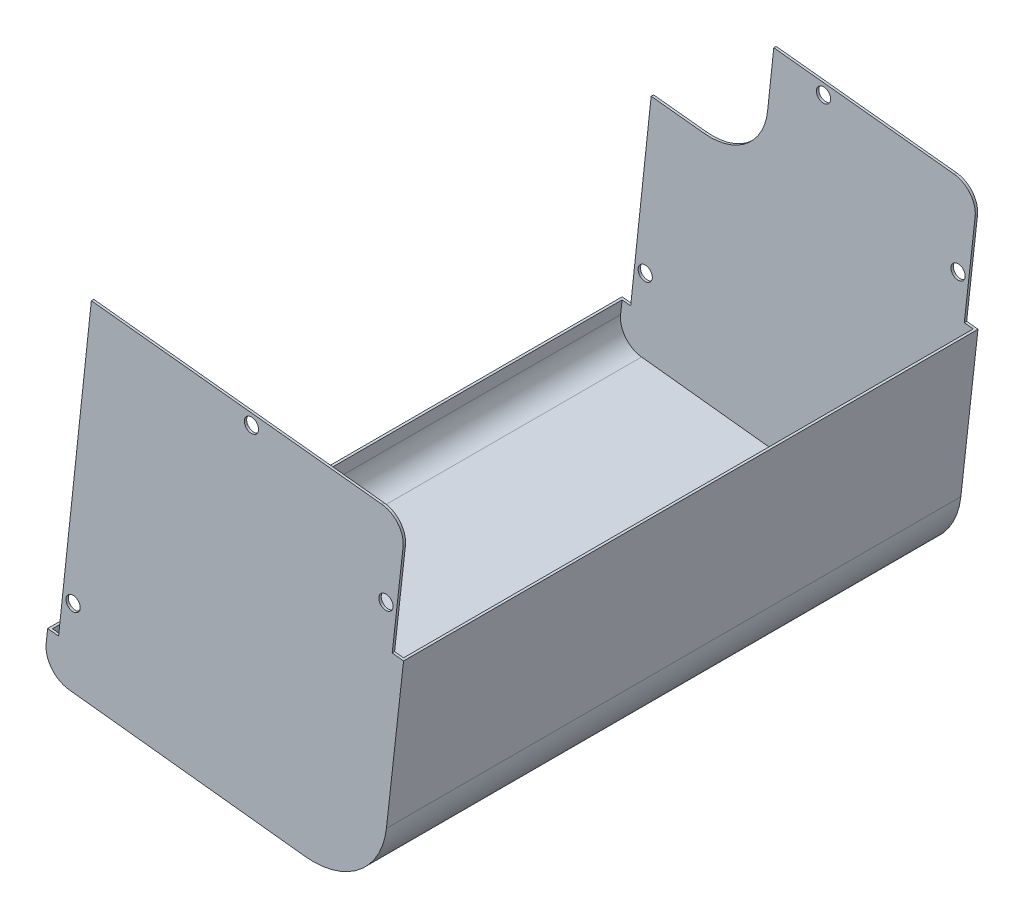
ISO-10303-21;
HEADER;
FILE_DESCRIPTION(('STEP AP214'),'2;1');
FILE_NAME('part.step','',(''),(''),'','','');
FILE_SCHEMA(('AUTOMOTIVE_DESIGN { 1 0 10303 214 1 1 1 1 }'));
ENDSEC;
DATA;
#1=APPLICATION_CONTEXT('core data for automotive mechanical design processes');
#2=APPLICATION_PROTOCOL_DEFINITION('international standard','automotive_design',2000,#1);
#3=PRODUCT_CONTEXT('',#1,'mechanical');
#4=PRODUCT('Part','Part','',(#3));
#5=PRODUCT_RELATED_PRODUCT_CATEGORY('part','',(#4));
#6=PRODUCT_DEFINITION_FORMATION('','',#4);
#7=PRODUCT_DEFINITION_CONTEXT('part definition',#1,'design');
#8=PRODUCT_DEFINITION('design','',#6,#7);
#9=PRODUCT_DEFINITION_SHAPE('','',#8);
#10=(LENGTH_UNIT() NAMED_UNIT(*) SI_UNIT(.MILLI.,.METRE.));
#11=(NAMED_UNIT(*) PLANE_ANGLE_UNIT() SI_UNIT($,.RADIAN.));
#12=(NAMED_UNIT(*) SI_UNIT($,.STERADIAN.) SOLID_ANGLE_UNIT());
#13=UNCERTAINTY_MEASURE_WITH_UNIT(LENGTH_MEASURE(1.E-05),#10,'distance_accuracy_value','');
#14=(GEOMETRIC_REPRESENTATION_CONTEXT(3) GLOBAL_UNCERTAINTY_ASSIGNED_CONTEXT((#13)) GLOBAL_UNIT_ASSIGNED_CONTEXT((#10,
#11,#12)) REPRESENTATION_CONTEXT('',''));
#15=CARTESIAN_POINT('',(0.,0.,0.));
#16=DIRECTION('',(0.,0.,1.));
#17=DIRECTION('',(1.,0.,0.));
#18=AXIS2_PLACEMENT_3D('',#15,#16,#17);
#19=CARTESIAN_POINT('',(88.6136563596164,-4.6918111080905,240.));
#20=DIRECTION('',(-0.110814083964882,-0.993841153703661,0.));
#21=DIRECTION('',(0.993841153703661,-0.110814083964882,0.));
#22=AXIS2_PLACEMENT_3D('',#19,#20,#21);
#23=PLANE('',#22);
#24=DIRECTION('',(-0.993841153703661,0.110814083964882,0.));
#25=VECTOR('',#24,1.);
#26=CARTESIAN_POINT('',(88.6136563596164,-4.6918111080905,0.));
#27=LINE('',#26,#25);
#28=CARTESIAN_POINT('',(88.6136563596164,-4.6918111080905,0.));
#29=VERTEX_POINT('',#28);
#30=CARTESIAN_POINT('',(84.8370599756829,-4.2707175890396,0.));
#31=VERTEX_POINT('',#30);
#32=EDGE_CURVE('E337',#29,#31,#27,.T.);
#33=ORIENTED_EDGE('',*,*,#32,.F.);
#34=DIRECTION('',(0.,0.,-1.));
#35=VECTOR('',#34,1.);
#36=CARTESIAN_POINT('',(88.6136563596164,-4.6918111080905,240.));
#37=LINE('',#36,#35);
#38=CARTESIAN_POINT('',(88.6136563596164,-4.6918111080905,240.));
#39=VERTEX_POINT('',#38);
#40=EDGE_CURVE('E365',#39,#29,#37,.T.);
#41=ORIENTED_EDGE('',*,*,#40,.F.);
#42=DIRECTION('',(-0.993841153703661,0.110814083964882,0.));
#43=VECTOR('',#42,1.);
#44=CARTESIAN_POINT('',(88.6136563596164,-4.6918111080905,240.));
#45=LINE('',#44,#43);
#46=CARTESIAN_POINT('',(84.8370599756829,-4.2707175890396,240.));
#47=VERTEX_POINT('',#46);
#48=EDGE_CURVE('E309',#39,#47,#45,.T.);
#49=ORIENTED_EDGE('',*,*,#48,.T.);
#50=DIRECTION('',(0.,0.,-1.));
#51=VECTOR('',#50,1.);
#52=CARTESIAN_POINT('',(84.8370599756829,-4.2707175890396,240.));
#53=LINE('',#52,#51);
#54=CARTESIAN_POINT('',(84.8370599756829,-4.2707175890396,241.));
#55=VERTEX_POINT('',#54);
#56=EDGE_CURVE('E378',#55,#47,#53,.T.);
#57=ORIENTED_EDGE('',*,*,#56,.F.);
#58=DIRECTION('',(-0.993841153703661,0.110814083964882,0.));
#59=VECTOR('',#58,1.);
#60=CARTESIAN_POINT('',(58.7984217485065,-1.36738858914402,241.));
#61=LINE('',#60,#59);
#62=CARTESIAN_POINT('',(89.60749751332,-4.80262519205538,241.));
#63=VERTEX_POINT('',#62);
#64=EDGE_CURVE('E252',#63,#55,#61,.T.);
#65=ORIENTED_EDGE('',*,*,#64,.F.);
#66=DIRECTION('',(0.,0.,-1.));
#67=VECTOR('',#66,1.);
#68=CARTESIAN_POINT('',(89.60749751332,-4.80262519205538,240.));
#69=LINE('',#68,#67);
#70=CARTESIAN_POINT('',(89.60749751332,-4.80262519205538,-1.));
#71=VERTEX_POINT('',#70);
#72=EDGE_CURVE('E381',#63,#71,#69,.T.);
#73=ORIENTED_EDGE('',*,*,#72,.T.);
#74=DIRECTION('',(-0.993841153703661,0.110814083964882,0.));
#75=VECTOR('',#74,1.);
#76=CARTESIAN_POINT('',(58.7984217485065,-1.36738858914402,-1.));
#77=LINE('',#76,#75);
#78=CARTESIAN_POINT('',(84.8370599756829,-4.2707175890396,-1.));
#79=VERTEX_POINT('',#78);
#80=EDGE_CURVE('E405',#71,#79,#77,.T.);
#81=ORIENTED_EDGE('',*,*,#80,.T.);
#82=EDGE_CURVE('E382',#31,#79,#53,.T.);
#83=ORIENTED_EDGE('',*,*,#82,.F.);
#84=EDGE_LOOP('',(#33,#41,#49,#57,#65,#73,#81,#83));
#85=FACE_BOUND('',#84,.T.);
#86=ADVANCED_FACE('F32',(#85),#23,.F.);
#87=CARTESIAN_POINT('',(89.4084892426148,36.7283537765712,240.));
#88=DIRECTION('',(-0.993841153703845,0.110814083963228,0.));
#89=DIRECTION('',(-0.110814083963228,-0.993841153703846,0.));
#90=AXIS2_PLACEMENT_3D('',#87,#88,#89);
#91=PLANE('',#90);
#92=DIRECTION('',(0.110814083963228,0.993841153703846,0.));
#93=VECTOR('',#92,1.);
#94=CARTESIAN_POINT('',(89.4084892426148,36.7283537765712,0.));
#95=LINE('',#94,#93);
#96=CARTESIAN_POINT('',(89.4084892426148,36.7283537765712,0.));
#97=VERTEX_POINT('',#96);
#98=EDGE_CURVE('E339',#31,#97,#95,.T.);
#99=ORIENTED_EDGE('',*,*,#98,.F.);
#100=ORIENTED_EDGE('',*,*,#82,.T.);
#101=DIRECTION('',(0.110814083963228,0.993841153703846,0.));
#102=VECTOR('',#101,1.);
#103=CARTESIAN_POINT('',(77.623843773693,-68.9627752744123,-1.));
#104=LINE('',#103,#102);
#105=CARTESIAN_POINT('',(89.4084892426148,36.7283537765712,-1.));
#106=VERTEX_POINT('',#105);
#107=EDGE_CURVE('E230',#79,#106,#104,.T.);
#108=ORIENTED_EDGE('',*,*,#107,.T.);
#109=DIRECTION('',(0.,0.,-1.));
#110=VECTOR('',#109,1.);
#111=CARTESIAN_POINT('',(89.4084892426148,36.7283537765712,240.));
#112=LINE('',#111,#110);
#113=EDGE_CURVE('E386',#97,#106,#112,.T.);
#114=ORIENTED_EDGE('',*,*,#113,.F.);
#115=EDGE_LOOP('',(#99,#100,#108,#114));
#116=FACE_BOUND('',#115,.T.);
#117=ADVANCED_FACE('F427',(#116),#91,.F.);
#118=CARTESIAN_POINT('',(79.4700777055763,37.8364946162036,240.));
#119=DIRECTION('',(0.,0.,-1.));
#120=DIRECTION('',(-1.,0.,0.));
#121=AXIS2_PLACEMENT_3D('',#118,#119,#120);
#122=CYLINDRICAL_SURFACE('',#121,10.);
#123=CARTESIAN_POINT('',(79.4700777055763,37.8364946162036,0.));
#124=DIRECTION('',(0.,0.,1.));
#125=DIRECTION('',(1.,0.,0.));
#126=AXIS2_PLACEMENT_3D('',#123,#124,#125);
#127=CIRCLE('',#126,10.);
#128=CARTESIAN_POINT('',(80.5317089221304,47.7799818897932,0.));
#129=VERTEX_POINT('',#128);
#130=EDGE_CURVE('E341',#97,#129,#127,.T.);
#131=ORIENTED_EDGE('',*,*,#130,.F.);
#132=ORIENTED_EDGE('',*,*,#113,.T.);
#133=CARTESIAN_POINT('',(79.4700777055763,37.8364946162036,-1.));
#134=DIRECTION('',(0.,0.,-1.));
#135=DIRECTION('',(-1.,0.,0.));
#136=AXIS2_PLACEMENT_3D('',#133,#134,#135);
#137=CIRCLE('',#136,10.);
#138=CARTESIAN_POINT('',(80.5317089221304,47.7799818897932,-1.));
#139=VERTEX_POINT('',#138);
#140=EDGE_CURVE('E226',#106,#139,#137,.F.);
#141=ORIENTED_EDGE('',*,*,#140,.T.);
#142=DIRECTION('',(0.,0.,-1.));
#143=VECTOR('',#142,1.);
#144=CARTESIAN_POINT('',(80.5317089221304,47.7799818897932,240.));
#145=LINE('',#144,#143);
#146=EDGE_CURVE('E223',#129,#139,#145,.T.);
#147=ORIENTED_EDGE('',*,*,#146,.F.);
#148=EDGE_LOOP('',(#131,#132,#141,#147));
#149=FACE_BOUND('',#148,.T.);
#150=ADVANCED_FACE('F432',(#149),#122,.T.);
#151=CARTESIAN_POINT('',(80.5317089221304,47.7799818897932,240.));
#152=DIRECTION('',(-0.106163121655407,-0.994348727358958,0.));
#153=DIRECTION('',(0.994348727358958,-0.106163121655407,0.));
#154=AXIS2_PLACEMENT_3D('',#151,#152,#153);
#155=PLANE('',#154);
#156=DIRECTION('',(-0.994348727358958,0.106163121655407,0.));
#157=VECTOR('',#156,1.);
#158=CARTESIAN_POINT('',(63.9287005791206,49.5526267839505,-1.));
#159=LINE('',#158,#157);
#160=CARTESIAN_POINT('',(4.5746539175209,55.8896499058209,-1.));
#161=VERTEX_POINT('',#160);
#162=EDGE_CURVE('E216',#139,#161,#159,.T.);
#163=ORIENTED_EDGE('',*,*,#162,.T.);
#164=DIRECTION('',(0.,0.,-1.));
#165=VECTOR('',#164,1.);
#166=CARTESIAN_POINT('',(4.5746539175209,55.8896499058209,9.));
#167=LINE('',#166,#165);
#168=CARTESIAN_POINT('',(4.5746539175209,55.8896499058209,0.));
#169=VERTEX_POINT('',#168);
#170=EDGE_CURVE('E199',#169,#161,#167,.T.);
#171=ORIENTED_EDGE('',*,*,#170,.F.);
#172=DIRECTION('',(-0.994348727358958,0.106163121655407,0.));
#173=VECTOR('',#172,1.);
#174=CARTESIAN_POINT('',(80.5317089221304,47.7799818897932,0.));
#175=LINE('',#174,#173);
#176=EDGE_CURVE('E343',#129,#169,#175,.T.);
#177=ORIENTED_EDGE('',*,*,#176,.F.);
#178=ORIENTED_EDGE('',*,*,#146,.T.);
#179=EDGE_LOOP('',(#163,#171,#177,#178));
#180=FACE_BOUND('',#179,.T.);
#181=ADVANCED_FACE('F221',(#180),#155,.F.);
#182=CARTESIAN_POINT('',(-41.908935769655,60.8525395351433,240.));
#183=DIRECTION('',(0.99434872735897,-0.10616312165529,0.));
#184=DIRECTION('',(0.10616312165529,0.994348727358971,0.));
#185=AXIS2_PLACEMENT_3D('',#182,#183,#184);
#186=PLANE('',#185);
#187=DIRECTION('',(-0.10616312165529,-0.99434872735897,0.));
#188=VECTOR('',#187,1.);
#189=CARTESIAN_POINT('',(-41.908935769655,60.8525395351433,0.));
#190=LINE('',#189,#188);
#191=CARTESIAN_POINT('',(-47.0841516422766,12.380252393304,0.));
#192=VERTEX_POINT('',#191);
#193=CARTESIAN_POINT('',(-55.7101415848428,-68.4127950215236,0.));
#194=VERTEX_POINT('',#193);
#195=EDGE_CURVE('E345',#192,#194,#190,.T.);
#196=ORIENTED_EDGE('',*,*,#195,.F.);
#197=DIRECTION('',(0.,0.,-1.));
#198=VECTOR('',#197,1.);
#199=CARTESIAN_POINT('',(-47.0841516422766,12.380252393304,9.));
#200=LINE('',#199,#198);
#201=CARTESIAN_POINT('',(-47.0841516422766,12.380252393304,-1.));
#202=VERTEX_POINT('',#201);
#203=EDGE_CURVE('E296',#192,#202,#200,.T.);
#204=ORIENTED_EDGE('',*,*,#203,.T.);
#205=DIRECTION('',(-0.10616312165529,-0.994348727358971,0.));
#206=VECTOR('',#205,1.);
#207=CARTESIAN_POINT('',(-54.2524308023591,-54.7595335233692,-1.));
#208=LINE('',#207,#206);
#209=CARTESIAN_POINT('',(-55.7101415848428,-68.4127950215236,-1.));
#210=VERTEX_POINT('',#209);
#211=EDGE_CURVE('E225',#202,#210,#208,.T.);
#212=ORIENTED_EDGE('',*,*,#211,.T.);
#213=DIRECTION('',(0.,0.,-1.));
#214=VECTOR('',#213,1.);
#215=CARTESIAN_POINT('',(-55.7101415848428,-68.4127950215236,240.));
#216=LINE('',#215,#214);
#217=EDGE_CURVE('E239',#194,#210,#216,.T.);
#218=ORIENTED_EDGE('',*,*,#217,.F.);
#219=EDGE_LOOP('',(#196,#204,#212,#218));
#220=FACE_BOUND('',#219,.T.);
#221=ADVANCED_FACE('F473',(#220),#186,.F.);
#222=CARTESIAN_POINT('',(-59.1903621305991,-68.0412240957289,240.));
#223=DIRECTION('',(-0.10616312165561,-0.994348727358936,0.));
#224=DIRECTION('',(0.994348727358936,-0.10616312165561,0.));
#225=AXIS2_PLACEMENT_3D('',#222,#223,#224);
#226=PLANE('',#225);
#227=DIRECTION('',(-0.994348727358936,0.10616312165561,0.));
#228=VECTOR('',#227,1.);
#229=CARTESIAN_POINT('',(-59.1903621305991,-68.0412240957289,0.));
#230=LINE('',#229,#228);
#231=CARTESIAN_POINT('',(-59.3159407122118,-68.0278165115783,0.));
#232=VERTEX_POINT('',#231);
#233=EDGE_CURVE('E347',#194,#232,#230,.T.);
#234=ORIENTED_EDGE('',*,*,#233,.F.);
#235=ORIENTED_EDGE('',*,*,#217,.T.);
#236=DIRECTION('',(-0.994348727358936,0.10616312165561,0.));
#237=VECTOR('',#236,1.);
#238=CARTESIAN_POINT('',(50.1274947639124,-79.712707772736,-1.));
#239=LINE('',#238,#237);
#240=CARTESIAN_POINT('',(-60.3103003223799,-67.9216522280034,-1.));
#241=VERTEX_POINT('',#240);
#242=EDGE_CURVE('E228',#210,#241,#239,.T.);
#243=ORIENTED_EDGE('',*,*,#242,.T.);
#244=DIRECTION('',(0.,0.,-1.));
#245=VECTOR('',#244,1.);
#246=CARTESIAN_POINT('',(-60.3103003223799,-67.9216522280034,240.));
#247=LINE('',#246,#245);
#248=CARTESIAN_POINT('',(-60.3103003223799,-67.9216522280034,241.));
#249=VERTEX_POINT('',#248);
#250=EDGE_CURVE('E236',#249,#241,#247,.T.);
#251=ORIENTED_EDGE('',*,*,#250,.F.);
#252=DIRECTION('',(-0.994348727358936,0.10616312165561,0.));
#253=VECTOR('',#252,1.);
#254=CARTESIAN_POINT('',(50.1274947639124,-79.712707772736,241.));
#255=LINE('',#254,#253);
#256=CARTESIAN_POINT('',(-55.7101415848428,-68.4127950215236,241.));
#257=VERTEX_POINT('',#256);
#258=EDGE_CURVE('E241',#257,#249,#255,.T.);
#259=ORIENTED_EDGE('',*,*,#258,.F.);
#260=CARTESIAN_POINT('',(-55.7101415848428,-68.4127950215236,240.));
#261=VERTEX_POINT('',#260);
#262=EDGE_CURVE('E372',#257,#261,#216,.T.);
#263=ORIENTED_EDGE('',*,*,#262,.T.);
#264=DIRECTION('',(-0.994348727358936,0.10616312165561,0.));
#265=VECTOR('',#264,1.);
#266=CARTESIAN_POINT('',(-59.1903621305991,-68.0412240957289,240.));
#267=LINE('',#266,#265);
#268=CARTESIAN_POINT('',(-59.3159407122118,-68.0278165115783,240.));
#269=VERTEX_POINT('',#268);
#270=EDGE_CURVE('E324',#261,#269,#267,.T.);
#271=ORIENTED_EDGE('',*,*,#270,.T.);
#272=DIRECTION('',(0.,0.,-1.));
#273=VECTOR('',#272,1.);
#274=CARTESIAN_POINT('',(-59.3159407122118,-68.0278165115783,240.));
#275=LINE('',#274,#273);
#276=EDGE_CURVE('E362',#269,#232,#275,.T.);
#277=ORIENTED_EDGE('',*,*,#276,.T.);
#278=EDGE_LOOP('',(#234,#235,#243,#251,#259,#263,#271,#277));
#279=FACE_BOUND('',#278,.T.);
#280=ADVANCED_FACE('F467',(#279),#226,.F.);
#281=CARTESIAN_POINT('',(51.5852055464041,-66.0594462745481,240.));
#282=DIRECTION('',(0.,0.,-1.));
#283=DIRECTION('',(-1.,0.,0.));
#284=AXIS2_PLACEMENT_3D('',#281,#282,#283);
#285=CYLINDRICAL_SURFACE('',#284,31.);
#286=CARTESIAN_POINT('',(51.5852055464041,-66.0594462745481,-1.));
#287=DIRECTION('',(0.,0.,-1.));
#288=DIRECTION('',(-1.,0.,0.));
#289=AXIS2_PLACEMENT_3D('',#286,#287,#288);
#290=CIRCLE('',#289,31.);
#291=CARTESIAN_POINT('',(48.1499689434923,-96.8685220393615,-1.));
#292=VERTEX_POINT('',#291);
#293=CARTESIAN_POINT('',(82.3942813112176,-69.4946828774592,-1.));
#294=VERTEX_POINT('',#293);
#295=EDGE_CURVE('E371',#292,#294,#290,.F.);
#296=ORIENTED_EDGE('',*,*,#295,.T.);
#297=DIRECTION('',(0.,0.,1.));
#298=VECTOR('',#297,1.);
#299=CARTESIAN_POINT('',(82.3942813112176,-69.4946828774592,240.));
#300=LINE('',#299,#298);
#301=CARTESIAN_POINT('',(82.3942813112176,-69.4946828774592,241.));
#302=VERTEX_POINT('',#301);
#303=EDGE_CURVE('E256',#302,#294,#300,.F.);
#304=ORIENTED_EDGE('',*,*,#303,.F.);
#305=CARTESIAN_POINT('',(51.5852055464041,-66.0594462745481,241.));
#306=DIRECTION('',(0.,0.,-1.));
#307=DIRECTION('',(-1.,0.,0.));
#308=AXIS2_PLACEMENT_3D('',#305,#306,#307);
#309=CIRCLE('',#308,31.);
#310=CARTESIAN_POINT('',(48.1499689434923,-96.8685220393615,241.));
#311=VERTEX_POINT('',#310);
#312=EDGE_CURVE('E395',#311,#302,#309,.F.);
#313=ORIENTED_EDGE('',*,*,#312,.F.);
#314=DIRECTION('',(0.,0.,-1.));
#315=VECTOR('',#314,1.);
#316=CARTESIAN_POINT('',(48.1499689434923,-96.8685220393615,240.));
#317=LINE('',#316,#315);
#318=EDGE_CURVE('E399',#311,#292,#317,.T.);
#319=ORIENTED_EDGE('',*,*,#318,.T.);
#320=EDGE_LOOP('',(#296,#304,#313,#319));
#321=FACE_BOUND('',#320,.T.);
#322=ADVANCED_FACE('F447',(#321),#285,.T.);
#323=CARTESIAN_POINT('',(89.60749751332,-4.80262519205538,240.));
#324=DIRECTION('',(-0.993841153703661,0.110814083964884,0.));
#325=DIRECTION('',(-0.110814083964884,-0.993841153703661,0.));
#326=AXIS2_PLACEMENT_3D('',#323,#324,#325);
#327=PLANE('',#326);
#328=DIRECTION('',(0.110814083964884,0.993841153703661,0.));
#329=VECTOR('',#328,1.);
#330=CARTESIAN_POINT('',(82.3942813112176,-69.4946828774594,-1.));
#331=LINE('',#330,#329);
#332=EDGE_CURVE('E392',#294,#71,#331,.T.);
#333=ORIENTED_EDGE('',*,*,#332,.T.);
#334=ORIENTED_EDGE('',*,*,#72,.F.);
#335=DIRECTION('',(0.110814083964884,0.993841153703661,0.));
#336=VECTOR('',#335,1.);
#337=CARTESIAN_POINT('',(82.3942813112176,-69.4946828774594,241.));
#338=LINE('',#337,#336);
#339=EDGE_CURVE('E254',#302,#63,#338,.T.);
#340=ORIENTED_EDGE('',*,*,#339,.F.);
#341=ORIENTED_EDGE('',*,*,#303,.T.);
#342=EDGE_LOOP('',(#333,#334,#340,#341));
#343=FACE_BOUND('',#342,.T.);
#344=ADVANCED_FACE('F444',(#343),#327,.F.);
#345=ORIENTED_EDGE('',*,*,#56,.T.);
#346=DIRECTION('',(0.110814083963228,0.993841153703846,0.));
#347=VECTOR('',#346,1.);
#348=CARTESIAN_POINT('',(89.4084892426148,36.7283537765712,240.));
#349=LINE('',#348,#347);
#350=CARTESIAN_POINT('',(89.4084892426148,36.7283537765712,240.));
#351=VERTEX_POINT('',#350);
#352=EDGE_CURVE('E312',#47,#351,#349,.T.);
#353=ORIENTED_EDGE('',*,*,#352,.T.);
#354=CARTESIAN_POINT('',(89.4084892426148,36.7283537765712,241.));
#355=VERTEX_POINT('',#354);
#356=EDGE_CURVE('E387',#355,#351,#112,.T.);
#357=ORIENTED_EDGE('',*,*,#356,.F.);
#358=DIRECTION('',(0.110814083963228,0.993841153703846,0.));
#359=VECTOR('',#358,1.);
#360=CARTESIAN_POINT('',(77.623843773693,-68.9627752744123,241.));
#361=LINE('',#360,#359);
#362=EDGE_CURVE('E250',#55,#355,#361,.T.);
#363=ORIENTED_EDGE('',*,*,#362,.F.);
#364=EDGE_LOOP('',(#345,#353,#357,#363));
#365=FACE_BOUND('',#364,.T.);
#366=ADVANCED_FACE('F494',(#365),#91,.F.);
#367=ORIENTED_EDGE('',*,*,#356,.T.);
#368=CARTESIAN_POINT('',(79.4700777055763,37.8364946162036,240.));
#369=DIRECTION('',(0.,0.,1.));
#370=DIRECTION('',(1.,0.,0.));
#371=AXIS2_PLACEMENT_3D('',#368,#369,#370);
#372=CIRCLE('',#371,10.);
#373=CARTESIAN_POINT('',(80.5317089221304,47.7799818897932,240.));
#374=VERTEX_POINT('',#373);
#375=EDGE_CURVE('E315',#351,#374,#372,.T.);
#376=ORIENTED_EDGE('',*,*,#375,.T.);
#377=CARTESIAN_POINT('',(80.5317089221304,47.7799818897932,241.));
#378=VERTEX_POINT('',#377);
#379=EDGE_CURVE('E383',#378,#374,#145,.T.);
#380=ORIENTED_EDGE('',*,*,#379,.F.);
#381=CARTESIAN_POINT('',(79.4700777055763,37.8364946162036,241.));
#382=DIRECTION('',(0.,0.,-1.));
#383=DIRECTION('',(-1.,0.,0.));
#384=AXIS2_PLACEMENT_3D('',#381,#382,#383);
#385=CIRCLE('',#384,10.);
#386=EDGE_CURVE('E248',#355,#378,#385,.F.);
#387=ORIENTED_EDGE('',*,*,#386,.F.);
#388=EDGE_LOOP('',(#367,#376,#380,#387));
#389=FACE_BOUND('',#388,.T.);
#390=ADVANCED_FACE('F533',(#389),#122,.T.);
#391=ORIENTED_EDGE('',*,*,#379,.T.);
#392=DIRECTION('',(-0.994348727358958,0.106163121655407,0.));
#393=VECTOR('',#392,1.);
#394=CARTESIAN_POINT('',(80.5317089221304,47.7799818897932,240.));
#395=LINE('',#394,#393);
#396=CARTESIAN_POINT('',(-41.908935769655,60.8525395351433,240.));
#397=VERTEX_POINT('',#396);
#398=EDGE_CURVE('E318',#374,#397,#395,.T.);
#399=ORIENTED_EDGE('',*,*,#398,.T.);
#400=DIRECTION('',(0.,0.,-1.));
#401=VECTOR('',#400,1.);
#402=CARTESIAN_POINT('',(-41.908935769655,60.8525395351433,240.));
#403=LINE('',#402,#401);
#404=CARTESIAN_POINT('',(-41.908935769655,60.8525395351433,241.));
#405=VERTEX_POINT('',#404);
#406=EDGE_CURVE('E375',#405,#397,#403,.T.);
#407=ORIENTED_EDGE('',*,*,#406,.F.);
#408=DIRECTION('',(-0.994348727358958,0.106163121655407,0.));
#409=VECTOR('',#408,1.);
#410=CARTESIAN_POINT('',(63.9287005791206,49.5526267839505,241.));
#411=LINE('',#410,#409);
#412=EDGE_CURVE('E246',#378,#405,#411,.T.);
#413=ORIENTED_EDGE('',*,*,#412,.F.);
#414=EDGE_LOOP('',(#391,#399,#407,#413));
#415=FACE_BOUND('',#414,.T.);
#416=ADVANCED_FACE('F529',(#415),#155,.F.);
#417=ORIENTED_EDGE('',*,*,#406,.T.);
#418=DIRECTION('',(-0.10616312165529,-0.99434872735897,0.));
#419=VECTOR('',#418,1.);
#420=CARTESIAN_POINT('',(-41.908935769655,60.8525395351433,240.));
#421=LINE('',#420,#419);
#422=EDGE_CURVE('E321',#397,#261,#421,.T.);
#423=ORIENTED_EDGE('',*,*,#422,.T.);
#424=ORIENTED_EDGE('',*,*,#262,.F.);
#425=DIRECTION('',(-0.10616312165529,-0.994348727358971,0.));
#426=VECTOR('',#425,1.);
#427=CARTESIAN_POINT('',(-54.2524308023591,-54.7595335233692,241.));
#428=LINE('',#427,#426);
#429=EDGE_CURVE('E244',#405,#257,#428,.T.);
#430=ORIENTED_EDGE('',*,*,#429,.F.);
#431=EDGE_LOOP('',(#417,#423,#424,#430));
#432=FACE_BOUND('',#431,.T.);
#433=ADVANCED_FACE('F503',(#432),#186,.F.);
#434=CARTESIAN_POINT('',(-60.3097818659154,-67.9170024276134,240.));
#435=DIRECTION('',(0.99384115370366,-0.110814083964889,0.));
#436=DIRECTION('',(0.110814083964889,0.99384115370366,0.));
#437=AXIS2_PLACEMENT_3D('',#434,#435,#436);
#438=PLANE('',#437);
#439=DIRECTION('',(-0.110814083964889,-0.99384115370366,0.));
#440=VECTOR('',#439,1.);
#441=CARTESIAN_POINT('',(-58.7311625147031,-53.7590829544452,-1.));
#442=LINE('',#441,#440);
#443=CARTESIAN_POINT('',(-60.9474441940009,-73.6359060285184,-1.));
#444=VERTEX_POINT('',#443);
#445=EDGE_CURVE('E235',#241,#444,#442,.T.);
#446=ORIENTED_EDGE('',*,*,#445,.T.);
#447=DIRECTION('',(0.,0.,-1.));
#448=VECTOR('',#447,1.);
#449=CARTESIAN_POINT('',(-60.9474441940009,-73.6359060285184,240.));
#450=LINE('',#449,#448);
#451=CARTESIAN_POINT('',(-60.9474441940009,-73.6359060285184,241.));
#452=VERTEX_POINT('',#451);
#453=EDGE_CURVE('E240',#452,#444,#450,.T.);
#454=ORIENTED_EDGE('',*,*,#453,.F.);
#455=DIRECTION('',(-0.110814083964889,-0.99384115370366,0.));
#456=VECTOR('',#455,1.);
#457=CARTESIAN_POINT('',(-58.7311625147031,-53.7590829544452,241.));
#458=LINE('',#457,#456);
#459=EDGE_CURVE('E243',#249,#452,#458,.T.);
#460=ORIENTED_EDGE('',*,*,#459,.F.);
#461=ORIENTED_EDGE('',*,*,#250,.T.);
#462=EDGE_LOOP('',(#446,#454,#460,#461));
#463=FACE_BOUND('',#462,.T.);
#464=ADVANCED_FACE('F462',(#463),#438,.F.);
#465=CARTESIAN_POINT('',(-50.0151915032606,-74.8548609521323,240.));
#466=DIRECTION('',(0.,0.,-1.));
#467=DIRECTION('',(-1.,0.,0.));
#468=AXIS2_PLACEMENT_3D('',#465,#466,#467);
#469=CYLINDRICAL_SURFACE('',#468,11.);
#470=CARTESIAN_POINT('',(-50.0151915032606,-74.8548609521323,-1.));
#471=DIRECTION('',(0.,0.,-1.));
#472=DIRECTION('',(-1.,0.,0.));
#473=AXIS2_PLACEMENT_3D('',#470,#471,#472);
#474=CIRCLE('',#473,11.);
#475=CARTESIAN_POINT('',(-51.2341464268743,-85.7871136428725,-1.));
#476=VERTEX_POINT('',#475);
#477=EDGE_CURVE('E412',#444,#476,#474,.F.);
#478=ORIENTED_EDGE('',*,*,#477,.T.);
#479=DIRECTION('',(0.,0.,1.));
#480=VECTOR('',#479,1.);
#481=CARTESIAN_POINT('',(-51.2341464268743,-85.7871136428725,240.));
#482=LINE('',#481,#480);
#483=CARTESIAN_POINT('',(-51.2341464268743,-85.7871136428725,241.));
#484=VERTEX_POINT('',#483);
#485=EDGE_CURVE('E402',#484,#476,#482,.F.);
#486=ORIENTED_EDGE('',*,*,#485,.F.);
#487=CARTESIAN_POINT('',(-50.0151915032606,-74.8548609521323,241.));
#488=DIRECTION('',(0.,0.,-1.));
#489=DIRECTION('',(-1.,0.,0.));
#490=AXIS2_PLACEMENT_3D('',#487,#488,#489);
#491=CIRCLE('',#490,11.);
#492=EDGE_CURVE('E408',#452,#484,#491,.F.);
#493=ORIENTED_EDGE('',*,*,#492,.F.);
#494=ORIENTED_EDGE('',*,*,#453,.T.);
#495=EDGE_LOOP('',(#478,#486,#493,#494));
#496=FACE_BOUND('',#495,.T.);
#497=ADVANCED_FACE('F457',(#496),#469,.T.);
#498=CARTESIAN_POINT('',(-51.2341464268743,-85.7871136428725,240.));
#499=DIRECTION('',(0.110814083964889,0.99384115370366,0.));
#500=DIRECTION('',(-0.99384115370366,0.110814083964889,0.));
#501=AXIS2_PLACEMENT_3D('',#498,#499,#500);
#502=PLANE('',#501);
#503=DIRECTION('',(0.99384115370366,-0.110814083964889,0.));
#504=VECTOR('',#503,1.);
#505=CARTESIAN_POINT('',(48.1499689434925,-96.8685220393615,-1.));
#506=LINE('',#505,#504);
#507=EDGE_CURVE('E398',#476,#292,#506,.T.);
#508=ORIENTED_EDGE('',*,*,#507,.T.);
#509=ORIENTED_EDGE('',*,*,#318,.F.);
#510=DIRECTION('',(0.99384115370366,-0.110814083964889,0.));
#511=VECTOR('',#510,1.);
#512=CARTESIAN_POINT('',(48.1499689434925,-96.8685220393615,241.));
#513=LINE('',#512,#511);
#514=EDGE_CURVE('E403',#484,#311,#513,.T.);
#515=ORIENTED_EDGE('',*,*,#514,.F.);
#516=ORIENTED_EDGE('',*,*,#485,.T.);
#517=EDGE_LOOP('',(#508,#509,#515,#516));
#518=FACE_BOUND('',#517,.T.);
#519=ADVANCED_FACE('F451',(#518),#502,.F.);
#520=CARTESIAN_POINT('',(51.5852055464041,-66.0594462745481,241.));
#521=DIRECTION('',(0.,0.,-1.));
#522=DIRECTION('',(-1.,0.,0.));
#523=AXIS2_PLACEMENT_3D('',#520,#521,#522);
#524=PLANE('',#523);
#525=CARTESIAN_POINT('',(-49.5900439260634,-53.4781237949024,241.));
#526=DIRECTION('',(0.,0.,1.));
#527=DIRECTION('',(1.,0.,0.));
#528=AXIS2_PLACEMENT_3D('',#525,#526,#527);
#529=CIRCLE('',#528,3.);
#530=CARTESIAN_POINT('',(-46.5900439260634,-53.4781237949024,241.));
#531=VERTEX_POINT('',#530);
#532=EDGE_CURVE('E285',#531,#531,#529,.T.);
#533=ORIENTED_EDGE('',*,*,#532,.F.);
#534=EDGE_LOOP('',(#533));
#535=FACE_BOUND('',#534,.T.);
#536=CARTESIAN_POINT('',(82.2022479988941,12.9055473085098,241.));
#537=DIRECTION('',(0.,0.,1.));
#538=DIRECTION('',(1.,0.,0.));
#539=AXIS2_PLACEMENT_3D('',#536,#537,#538);
#540=CIRCLE('',#539,3.00000000000001);
#541=CARTESIAN_POINT('',(85.2022479988941,12.9055473085098,241.));
#542=VERTEX_POINT('',#541);
#543=EDGE_CURVE('E275',#542,#542,#540,.T.);
#544=ORIENTED_EDGE('',*,*,#543,.F.);
#545=EDGE_LOOP('',(#544));
#546=FACE_BOUND('',#545,.T.);
#547=CARTESIAN_POINT('',(25.5273482615579,49.1270290529497,241.));
#548=DIRECTION('',(0.,0.,1.));
#549=DIRECTION('',(1.,0.,0.));
#550=AXIS2_PLACEMENT_3D('',#547,#548,#549);
#551=CIRCLE('',#550,3.);
#552=CARTESIAN_POINT('',(28.5273482615579,49.1270290529497,241.));
#553=VERTEX_POINT('',#552);
#554=EDGE_CURVE('E272',#553,#553,#551,.T.);
#555=ORIENTED_EDGE('',*,*,#554,.F.);
#556=EDGE_LOOP('',(#555));
#557=FACE_BOUND('',#556,.T.);
#558=ORIENTED_EDGE('',*,*,#312,.T.);
#559=ORIENTED_EDGE('',*,*,#339,.T.);
#560=ORIENTED_EDGE('',*,*,#64,.T.);
#561=ORIENTED_EDGE('',*,*,#362,.T.);
#562=ORIENTED_EDGE('',*,*,#386,.T.);
#563=ORIENTED_EDGE('',*,*,#412,.T.);
#564=ORIENTED_EDGE('',*,*,#429,.T.);
#565=ORIENTED_EDGE('',*,*,#258,.T.);
#566=ORIENTED_EDGE('',*,*,#459,.T.);
#567=ORIENTED_EDGE('',*,*,#492,.T.);
#568=ORIENTED_EDGE('',*,*,#514,.T.);
#569=EDGE_LOOP('',(#558,#559,#560,#561,#562,#563,#564,#565,#566,#567,#568));
#570=FACE_BOUND('',#569,.T.);
#571=ADVANCED_FACE('F507',(#535,#546,#557,#570),#524,.F.);
#572=CARTESIAN_POINT('',(51.5852055464041,-66.0594462745481,-1.));
#573=DIRECTION('',(0.,0.,-1.));
#574=DIRECTION('',(-1.,0.,0.));
#575=AXIS2_PLACEMENT_3D('',#572,#573,#574);
#576=PLANE('',#575);
#577=CARTESIAN_POINT('',(-49.5900439260634,-53.4781237949024,-1.));
#578=DIRECTION('',(0.,0.,-1.));
#579=DIRECTION('',(-1.,0.,0.));
#580=AXIS2_PLACEMENT_3D('',#577,#578,#579);
#581=CIRCLE('',#580,3.);
#582=CARTESIAN_POINT('',(-52.5900439260634,-53.4781237949024,-1.));
#583=VERTEX_POINT('',#582);
#584=EDGE_CURVE('E269',#583,#583,#581,.T.);
#585=ORIENTED_EDGE('',*,*,#584,.F.);
#586=EDGE_LOOP('',(#585));
#587=FACE_BOUND('',#586,.T.);
#588=CARTESIAN_POINT('',(82.2022479988941,12.9055473085098,-1.));
#589=DIRECTION('',(0.,0.,-1.));
#590=DIRECTION('',(-1.,0.,0.));
#591=AXIS2_PLACEMENT_3D('',#588,#589,#590);
#592=CIRCLE('',#591,3.00000000000001);
#593=CARTESIAN_POINT('',(79.2022479988941,12.9055473085098,-1.));
#594=VERTEX_POINT('',#593);
#595=EDGE_CURVE('E265',#594,#594,#592,.T.);
#596=ORIENTED_EDGE('',*,*,#595,.F.);
#597=EDGE_LOOP('',(#596));
#598=FACE_BOUND('',#597,.T.);
#599=CARTESIAN_POINT('',(25.5273482615579,49.1270290529497,-1.));
#600=DIRECTION('',(0.,0.,-1.));
#601=DIRECTION('',(-1.,0.,0.));
#602=AXIS2_PLACEMENT_3D('',#599,#600,#601);
#603=CIRCLE('',#602,3.);
#604=CARTESIAN_POINT('',(22.5273482615579,49.1270290529497,-1.));
#605=VERTEX_POINT('',#604);
#606=EDGE_CURVE('E261',#605,#605,#603,.T.);
#607=ORIENTED_EDGE('',*,*,#606,.F.);
#608=EDGE_LOOP('',(#607));
#609=FACE_BOUND('',#608,.T.);
#610=DIRECTION('',(-0.994348727358524,0.106163121659478,0.));
#611=VECTOR('',#610,1.);
#612=CARTESIAN_POINT('',(-47.0841516422766,12.380252393304,-1.));
#613=LINE('',#612,#611);
#614=CARTESIAN_POINT('',(-24.711305276866,9.99158215598245,-1.));
#615=VERTEX_POINT('',#614);
#616=EDGE_CURVE('E210',#615,#202,#613,.T.);
#617=ORIENTED_EDGE('',*,*,#616,.F.);
#618=CARTESIAN_POINT('',(-22.1370858846969,34.1023254775238,-1.));
#619=DIRECTION('',(0.,0.,-1.));
#620=DIRECTION('',(-1.,0.,0.));
#621=AXIS2_PLACEMENT_3D('',#618,#619,#620);
#622=CIRCLE('',#621,24.2477741039517);
#623=CARTESIAN_POINT('',(1.97365743684444,31.5281060853549,-1.));
#624=VERTEX_POINT('',#623);
#625=EDGE_CURVE('E218',#624,#615,#622,.T.);
#626=ORIENTED_EDGE('',*,*,#625,.F.);
#627=DIRECTION('',(-0.10616312165947,-0.994348727358524,0.));
#628=VECTOR('',#627,1.);
#629=CARTESIAN_POINT('',(1.97365743684444,31.5281060853549,-1.));
#630=LINE('',#629,#628);
#631=EDGE_CURVE('E202',#161,#624,#630,.T.);
#632=ORIENTED_EDGE('',*,*,#631,.F.);
#633=ORIENTED_EDGE('',*,*,#162,.F.);
#634=ORIENTED_EDGE('',*,*,#140,.F.);
#635=ORIENTED_EDGE('',*,*,#107,.F.);
#636=ORIENTED_EDGE('',*,*,#80,.F.);
#637=ORIENTED_EDGE('',*,*,#332,.F.);
#638=ORIENTED_EDGE('',*,*,#295,.F.);
#639=ORIENTED_EDGE('',*,*,#507,.F.);
#640=ORIENTED_EDGE('',*,*,#477,.F.);
#641=ORIENTED_EDGE('',*,*,#445,.F.);
#642=ORIENTED_EDGE('',*,*,#242,.F.);
#643=ORIENTED_EDGE('',*,*,#211,.F.);
#644=EDGE_LOOP('',(#617,#626,#632,#633,#634,#635,#636,#637,#638,#639,#640,#641,#642,#643));
#645=FACE_BOUND('',#644,.T.);
#646=ADVANCED_FACE('F34',(#587,#598,#609,#645),#576,.T.);
#647=CARTESIAN_POINT('',(51.5852055464041,-66.0594462745481,240.));
#648=DIRECTION('',(0.,0.,-1.));
#649=DIRECTION('',(-1.,0.,0.));
#650=AXIS2_PLACEMENT_3D('',#647,#648,#649);
#651=CYLINDRICAL_SURFACE('',#650,30.);
#652=CARTESIAN_POINT('',(51.5852055464041,-66.0594462745481,0.));
#653=DIRECTION('',(0.,0.,1.));
#654=DIRECTION('',(-1.,0.,0.));
#655=AXIS2_PLACEMENT_3D('',#652,#653,#654);
#656=CIRCLE('',#655,30.);
#657=CARTESIAN_POINT('',(48.2607830274572,-95.8746808856578,0.));
#658=VERTEX_POINT('',#657);
#659=CARTESIAN_POINT('',(81.4004401575139,-69.3838687934944,0.));
#660=VERTEX_POINT('',#659);
#661=EDGE_CURVE('E299',#658,#660,#656,.T.);
#662=ORIENTED_EDGE('',*,*,#661,.F.);
#663=DIRECTION('',(0.,0.,-1.));
#664=VECTOR('',#663,1.);
#665=CARTESIAN_POINT('',(48.2607830274572,-95.8746808856578,240.));
#666=LINE('',#665,#664);
#667=CARTESIAN_POINT('',(48.2607830274572,-95.8746808856578,240.));
#668=VERTEX_POINT('',#667);
#669=EDGE_CURVE('E332',#668,#658,#666,.T.);
#670=ORIENTED_EDGE('',*,*,#669,.F.);
#671=CARTESIAN_POINT('',(51.5852055464041,-66.0594462745481,240.));
#672=DIRECTION('',(0.,0.,1.));
#673=DIRECTION('',(-1.,0.,0.));
#674=AXIS2_PLACEMENT_3D('',#671,#672,#673);
#675=CIRCLE('',#674,30.);
#676=CARTESIAN_POINT('',(81.4004401575139,-69.3838687934944,240.));
#677=VERTEX_POINT('',#676);
#678=EDGE_CURVE('E303',#668,#677,#675,.T.);
#679=ORIENTED_EDGE('',*,*,#678,.T.);
#680=DIRECTION('',(0.,0.,-1.));
#681=VECTOR('',#680,1.);
#682=CARTESIAN_POINT('',(81.4004401575139,-69.3838687934944,240.));
#683=LINE('',#682,#681);
#684=EDGE_CURVE('E368',#677,#660,#683,.T.);
#685=ORIENTED_EDGE('',*,*,#684,.T.);
#686=EDGE_LOOP('',(#662,#670,#679,#685));
#687=FACE_BOUND('',#686,.T.);
#688=ADVANCED_FACE('F513',(#687),#651,.F.);
#689=CARTESIAN_POINT('',(88.6136563596164,-4.6918111080905,240.));
#690=DIRECTION('',(-0.993841153703661,0.110814083964884,0.));
#691=DIRECTION('',(-0.110814083964884,-0.993841153703661,0.));
#692=AXIS2_PLACEMENT_3D('',#689,#690,#691);
#693=PLANE('',#692);
#694=DIRECTION('',(0.110814083964884,0.993841153703661,0.));
#695=VECTOR('',#694,1.);
#696=CARTESIAN_POINT('',(88.6136563596164,-4.6918111080905,0.));
#697=LINE('',#696,#695);
#698=EDGE_CURVE('E335',#660,#29,#697,.T.);
#699=ORIENTED_EDGE('',*,*,#698,.F.);
#700=ORIENTED_EDGE('',*,*,#684,.F.);
#701=DIRECTION('',(0.110814083964884,0.993841153703661,0.));
#702=VECTOR('',#701,1.);
#703=CARTESIAN_POINT('',(88.6136563596164,-4.6918111080905,240.));
#704=LINE('',#703,#702);
#705=EDGE_CURVE('E306',#677,#39,#704,.T.);
#706=ORIENTED_EDGE('',*,*,#705,.T.);
#707=ORIENTED_EDGE('',*,*,#40,.T.);
#708=EDGE_LOOP('',(#699,#700,#706,#707));
#709=FACE_BOUND('',#708,.T.);
#710=ADVANCED_FACE('F545',(#709),#693,.T.);
#711=CARTESIAN_POINT('',(-59.3159407122118,-68.0278165115783,240.));
#712=DIRECTION('',(0.99384115370366,-0.110814083964889,0.));
#713=DIRECTION('',(0.110814083964889,0.99384115370366,0.));
#714=AXIS2_PLACEMENT_3D('',#711,#712,#713);
#715=PLANE('',#714);
#716=DIRECTION('',(-0.110814083964889,-0.99384115370366,0.));
#717=VECTOR('',#716,1.);
#718=CARTESIAN_POINT('',(-59.3159407122118,-68.0278165115783,0.));
#719=LINE('',#718,#717);
#720=CARTESIAN_POINT('',(-59.9536030402972,-73.7467201124833,0.));
#721=VERTEX_POINT('',#720);
#722=EDGE_CURVE('E349',#232,#721,#719,.T.);
#723=ORIENTED_EDGE('',*,*,#722,.F.);
#724=ORIENTED_EDGE('',*,*,#276,.F.);
#725=DIRECTION('',(-0.110814083964889,-0.99384115370366,0.));
#726=VECTOR('',#725,1.);
#727=CARTESIAN_POINT('',(-59.3159407122118,-68.0278165115783,240.));
#728=LINE('',#727,#726);
#729=CARTESIAN_POINT('',(-59.9536030402972,-73.7467201124833,240.));
#730=VERTEX_POINT('',#729);
#731=EDGE_CURVE('E57',#269,#730,#728,.T.);
#732=ORIENTED_EDGE('',*,*,#731,.T.);
#733=DIRECTION('',(0.,0.,-1.));
#734=VECTOR('',#733,1.);
#735=CARTESIAN_POINT('',(-59.9536030402972,-73.7467201124833,240.));
#736=LINE('',#735,#734);
#737=EDGE_CURVE('E359',#730,#721,#736,.T.);
#738=ORIENTED_EDGE('',*,*,#737,.T.);
#739=EDGE_LOOP('',(#723,#724,#732,#738));
#740=FACE_BOUND('',#739,.T.);
#741=ADVANCED_FACE('F556',(#740),#715,.T.);
#742=CARTESIAN_POINT('',(-50.0151915032606,-74.8548609521323,240.));
#743=DIRECTION('',(0.,0.,-1.));
#744=DIRECTION('',(-1.,0.,0.));
#745=AXIS2_PLACEMENT_3D('',#742,#743,#744);
#746=CYLINDRICAL_SURFACE('',#745,10.);
#747=CARTESIAN_POINT('',(-50.0151915032606,-74.8548609521323,0.));
#748=DIRECTION('',(0.,0.,1.));
#749=DIRECTION('',(-1.,0.,0.));
#750=AXIS2_PLACEMENT_3D('',#747,#748,#749);
#751=CIRCLE('',#750,10.);
#752=CARTESIAN_POINT('',(-51.1233323429094,-84.7932724891689,0.));
#753=VERTEX_POINT('',#752);
#754=EDGE_CURVE('E351',#721,#753,#751,.T.);
#755=ORIENTED_EDGE('',*,*,#754,.F.);
#756=ORIENTED_EDGE('',*,*,#737,.F.);
#757=CARTESIAN_POINT('',(-50.0151915032606,-74.8548609521323,240.));
#758=DIRECTION('',(0.,0.,1.));
#759=DIRECTION('',(-1.,0.,0.));
#760=AXIS2_PLACEMENT_3D('',#757,#758,#759);
#761=CIRCLE('',#760,10.);
#762=CARTESIAN_POINT('',(-51.1233323429094,-84.7932724891689,240.));
#763=VERTEX_POINT('',#762);
#764=EDGE_CURVE('E328',#730,#763,#761,.T.);
#765=ORIENTED_EDGE('',*,*,#764,.T.);
#766=DIRECTION('',(0.,0.,-1.));
#767=VECTOR('',#766,1.);
#768=CARTESIAN_POINT('',(-51.1233323429094,-84.7932724891689,240.));
#769=LINE('',#768,#767);
#770=EDGE_CURVE('E356',#763,#753,#769,.T.);
#771=ORIENTED_EDGE('',*,*,#770,.T.);
#772=EDGE_LOOP('',(#755,#756,#765,#771));
#773=FACE_BOUND('',#772,.T.);
#774=ADVANCED_FACE('F553',(#773),#746,.F.);
#775=CARTESIAN_POINT('',(-51.1233323429094,-84.7932724891689,240.));
#776=DIRECTION('',(0.110814083964889,0.99384115370366,0.));
#777=DIRECTION('',(-0.99384115370366,0.110814083964889,0.));
#778=AXIS2_PLACEMENT_3D('',#775,#776,#777);
#779=PLANE('',#778);
#780=DIRECTION('',(0.99384115370366,-0.110814083964889,0.));
#781=VECTOR('',#780,1.);
#782=CARTESIAN_POINT('',(-51.1233323429094,-84.7932724891689,0.));
#783=LINE('',#782,#781);
#784=EDGE_CURVE('E307',#753,#658,#783,.T.);
#785=ORIENTED_EDGE('',*,*,#784,.F.);
#786=ORIENTED_EDGE('',*,*,#770,.F.);
#787=DIRECTION('',(0.99384115370366,-0.110814083964889,0.));
#788=VECTOR('',#787,1.);
#789=CARTESIAN_POINT('',(-51.1233323429094,-84.7932724891689,240.));
#790=LINE('',#789,#788);
#791=EDGE_CURVE('E330',#763,#668,#790,.T.);
#792=ORIENTED_EDGE('',*,*,#791,.T.);
#793=ORIENTED_EDGE('',*,*,#669,.T.);
#794=EDGE_LOOP('',(#785,#786,#792,#793));
#795=FACE_BOUND('',#794,.T.);
#796=ADVANCED_FACE('F550',(#795),#779,.T.);
#797=CARTESIAN_POINT('',(51.5852055464041,-66.0594462745481,240.));
#798=DIRECTION('',(0.,0.,-1.));
#799=DIRECTION('',(-1.,0.,0.));
#800=AXIS2_PLACEMENT_3D('',#797,#798,#799);
#801=PLANE('',#800);
#802=CARTESIAN_POINT('',(-49.5900439260634,-53.4781237949024,240.));
#803=DIRECTION('',(0.,0.,-1.));
#804=DIRECTION('',(-1.,0.,0.));
#805=AXIS2_PLACEMENT_3D('',#802,#803,#804);
#806=CIRCLE('',#805,3.);
#807=CARTESIAN_POINT('',(-52.5900439260634,-53.4781237949024,240.));
#808=VERTEX_POINT('',#807);
#809=EDGE_CURVE('E36',#808,#808,#806,.T.);
#810=ORIENTED_EDGE('',*,*,#809,.F.);
#811=EDGE_LOOP('',(#810));
#812=FACE_BOUND('',#811,.T.);
#813=CARTESIAN_POINT('',(82.2022479988941,12.9055473085098,240.));
#814=DIRECTION('',(0.,0.,-1.));
#815=DIRECTION('',(-1.,0.,0.));
#816=AXIS2_PLACEMENT_3D('',#813,#814,#815);
#817=CIRCLE('',#816,3.00000000000001);
#818=CARTESIAN_POINT('',(79.2022479988941,12.9055473085098,240.));
#819=VERTEX_POINT('',#818);
#820=EDGE_CURVE('E273',#819,#819,#817,.T.);
#821=ORIENTED_EDGE('',*,*,#820,.F.);
#822=EDGE_LOOP('',(#821));
#823=FACE_BOUND('',#822,.T.);
#824=CARTESIAN_POINT('',(25.5273482615579,49.1270290529497,240.));
#825=DIRECTION('',(0.,0.,-1.));
#826=DIRECTION('',(-1.,0.,0.));
#827=AXIS2_PLACEMENT_3D('',#824,#825,#826);
#828=CIRCLE('',#827,3.);
#829=CARTESIAN_POINT('',(22.5273482615579,49.1270290529497,240.));
#830=VERTEX_POINT('',#829);
#831=EDGE_CURVE('E270',#830,#830,#828,.T.);
#832=ORIENTED_EDGE('',*,*,#831,.F.);
#833=EDGE_LOOP('',(#832));
#834=FACE_BOUND('',#833,.T.);
#835=ORIENTED_EDGE('',*,*,#678,.F.);
#836=ORIENTED_EDGE('',*,*,#791,.F.);
#837=ORIENTED_EDGE('',*,*,#764,.F.);
#838=ORIENTED_EDGE('',*,*,#731,.F.);
#839=ORIENTED_EDGE('',*,*,#270,.F.);
#840=ORIENTED_EDGE('',*,*,#422,.F.);
#841=ORIENTED_EDGE('',*,*,#398,.F.);
#842=ORIENTED_EDGE('',*,*,#375,.F.);
#843=ORIENTED_EDGE('',*,*,#352,.F.);
#844=ORIENTED_EDGE('',*,*,#48,.F.);
#845=ORIENTED_EDGE('',*,*,#705,.F.);
#846=EDGE_LOOP('',(#835,#836,#837,#838,#839,#840,#841,#842,#843,#844,#845));
#847=FACE_BOUND('',#846,.T.);
#848=ADVANCED_FACE('F527',(#812,#823,#834,#847),#801,.T.);
#849=CARTESIAN_POINT('',(51.5852055464041,-66.0594462745481,0.));
#850=DIRECTION('',(0.,0.,-1.));
#851=DIRECTION('',(-1.,0.,0.));
#852=AXIS2_PLACEMENT_3D('',#849,#850,#851);
#853=PLANE('',#852);
#854=CARTESIAN_POINT('',(-49.5900439260634,-53.4781237949024,0.));
#855=DIRECTION('',(0.,0.,-1.));
#856=DIRECTION('',(-1.,0.,0.));
#857=AXIS2_PLACEMENT_3D('',#854,#855,#856);
#858=CIRCLE('',#857,3.);
#859=CARTESIAN_POINT('',(-52.5900439260634,-53.4781237949024,0.));
#860=VERTEX_POINT('',#859);
#861=EDGE_CURVE('E266',#860,#860,#858,.T.);
#862=ORIENTED_EDGE('',*,*,#861,.T.);
#863=EDGE_LOOP('',(#862));
#864=FACE_BOUND('',#863,.T.);
#865=CARTESIAN_POINT('',(82.2022479988941,12.9055473085098,0.));
#866=DIRECTION('',(0.,0.,-1.));
#867=DIRECTION('',(-1.,0.,0.));
#868=AXIS2_PLACEMENT_3D('',#865,#866,#867);
#869=CIRCLE('',#868,3.00000000000001);
#870=CARTESIAN_POINT('',(79.2022479988941,12.9055473085098,0.));
#871=VERTEX_POINT('',#870);
#872=EDGE_CURVE('E262',#871,#871,#869,.T.);
#873=ORIENTED_EDGE('',*,*,#872,.T.);
#874=EDGE_LOOP('',(#873));
#875=FACE_BOUND('',#874,.T.);
#876=CARTESIAN_POINT('',(25.5273482615579,49.1270290529497,0.));
#877=DIRECTION('',(0.,0.,-1.));
#878=DIRECTION('',(-1.,0.,0.));
#879=AXIS2_PLACEMENT_3D('',#876,#877,#878);
#880=CIRCLE('',#879,3.);
#881=CARTESIAN_POINT('',(22.5273482615579,49.1270290529497,0.));
#882=VERTEX_POINT('',#881);
#883=EDGE_CURVE('E219',#882,#882,#880,.T.);
#884=ORIENTED_EDGE('',*,*,#883,.T.);
#885=EDGE_LOOP('',(#884));
#886=FACE_BOUND('',#885,.T.);
#887=CARTESIAN_POINT('',(-22.1370858846969,34.1023254775238,0.));
#888=DIRECTION('',(0.,0.,-1.));
#889=DIRECTION('',(-1.,0.,0.));
#890=AXIS2_PLACEMENT_3D('',#887,#888,#889);
#891=CIRCLE('',#890,24.2477741039517);
#892=CARTESIAN_POINT('',(1.97365743684444,31.5281060853549,0.));
#893=VERTEX_POINT('',#892);
#894=CARTESIAN_POINT('',(-24.711305276866,9.99158215598245,0.));
#895=VERTEX_POINT('',#894);
#896=EDGE_CURVE('E41',#893,#895,#891,.T.);
#897=ORIENTED_EDGE('',*,*,#896,.T.);
#898=DIRECTION('',(-0.994348727358523,0.106163121659478,0.));
#899=VECTOR('',#898,1.);
#900=CARTESIAN_POINT('',(58.7534847067218,1.08033964164926,0.));
#901=LINE('',#900,#899);
#902=EDGE_CURVE('E11',#895,#192,#901,.T.);
#903=ORIENTED_EDGE('',*,*,#902,.T.);
#904=ORIENTED_EDGE('',*,*,#195,.T.);
#905=ORIENTED_EDGE('',*,*,#233,.T.);
#906=ORIENTED_EDGE('',*,*,#722,.T.);
#907=ORIENTED_EDGE('',*,*,#754,.T.);
#908=ORIENTED_EDGE('',*,*,#784,.T.);
#909=ORIENTED_EDGE('',*,*,#661,.T.);
#910=ORIENTED_EDGE('',*,*,#698,.T.);
#911=ORIENTED_EDGE('',*,*,#32,.T.);
#912=ORIENTED_EDGE('',*,*,#98,.T.);
#913=ORIENTED_EDGE('',*,*,#130,.T.);
#914=ORIENTED_EDGE('',*,*,#176,.T.);
#915=DIRECTION('',(-0.10616312165947,-0.994348727358524,0.));
#916=VECTOR('',#915,1.);
#917=CARTESIAN_POINT('',(-7.768841115642,-59.7224231523847,0.));
#918=LINE('',#917,#916);
#919=EDGE_CURVE('E205',#169,#893,#918,.T.);
#920=ORIENTED_EDGE('',*,*,#919,.T.);
#921=EDGE_LOOP('',(#897,#903,#904,#905,#906,#907,#908,#909,#910,#911,#912,#913,#914,#920));
#922=FACE_BOUND('',#921,.T.);
#923=ADVANCED_FACE('F434',(#864,#875,#886,#922),#853,.F.);
#924=CARTESIAN_POINT('',(-47.0841516422766,12.380252393304,9.));
#925=DIRECTION('',(-0.106163121659478,-0.994348727358523,0.));
#926=DIRECTION('',(0.994348727358523,-0.106163121659478,0.));
#927=AXIS2_PLACEMENT_3D('',#924,#925,#926);
#928=PLANE('',#927);
#929=DIRECTION('',(0.,0.,-1.));
#930=VECTOR('',#929,1.);
#931=CARTESIAN_POINT('',(-24.711305276866,9.99158215598245,9.));
#932=LINE('',#931,#930);
#933=EDGE_CURVE('E300',#895,#615,#932,.T.);
#934=ORIENTED_EDGE('',*,*,#933,.T.);
#935=ORIENTED_EDGE('',*,*,#616,.T.);
#936=ORIENTED_EDGE('',*,*,#203,.F.);
#937=ORIENTED_EDGE('',*,*,#902,.F.);
#938=EDGE_LOOP('',(#934,#935,#936,#937));
#939=FACE_BOUND('',#938,.T.);
#940=ADVANCED_FACE('F475',(#939),#928,.F.);
#941=CARTESIAN_POINT('',(-22.1370858846969,34.1023254775238,9.));
#942=DIRECTION('',(0.,0.,-1.));
#943=DIRECTION('',(-1.,0.,0.));
#944=AXIS2_PLACEMENT_3D('',#941,#942,#943);
#945=CYLINDRICAL_SURFACE('',#944,24.2477741039517);
#946=DIRECTION('',(0.,0.,-1.));
#947=VECTOR('',#946,1.);
#948=CARTESIAN_POINT('',(1.97365743684444,31.5281060853549,9.));
#949=LINE('',#948,#947);
#950=EDGE_CURVE('E49',#893,#624,#949,.T.);
#951=ORIENTED_EDGE('',*,*,#950,.T.);
#952=ORIENTED_EDGE('',*,*,#625,.T.);
#953=ORIENTED_EDGE('',*,*,#933,.F.);
#954=ORIENTED_EDGE('',*,*,#896,.F.);
#955=EDGE_LOOP('',(#951,#952,#953,#954));
#956=FACE_BOUND('',#955,.T.);
#957=ADVANCED_FACE('F478',(#956),#945,.F.);
#958=CARTESIAN_POINT('',(1.97365743684444,31.5281060853549,9.));
#959=DIRECTION('',(0.994348727358524,-0.10616312165947,0.));
#960=DIRECTION('',(0.10616312165947,0.994348727358524,0.));
#961=AXIS2_PLACEMENT_3D('',#958,#959,#960);
#962=PLANE('',#961);
#963=ORIENTED_EDGE('',*,*,#170,.T.);
#964=ORIENTED_EDGE('',*,*,#631,.T.);
#965=ORIENTED_EDGE('',*,*,#950,.F.);
#966=ORIENTED_EDGE('',*,*,#919,.F.);
#967=EDGE_LOOP('',(#963,#964,#965,#966));
#968=FACE_BOUND('',#967,.T.);
#969=ADVANCED_FACE('F201',(#968),#962,.F.);
#970=CARTESIAN_POINT('',(25.5273482615579,49.1270290529497,9.));
#971=DIRECTION('',(0.,0.,-1.));
#972=DIRECTION('',(-1.,0.,0.));
#973=AXIS2_PLACEMENT_3D('',#970,#971,#972);
#974=CYLINDRICAL_SURFACE('',#973,3.);
#975=ORIENTED_EDGE('',*,*,#606,.T.);
#976=EDGE_LOOP('',(#975));
#977=FACE_BOUND('',#976,.T.);
#978=ORIENTED_EDGE('',*,*,#883,.F.);
#979=EDGE_LOOP('',(#978));
#980=FACE_BOUND('',#979,.T.);
#981=ADVANCED_FACE('F485',(#977,#980),#974,.F.);
#982=CARTESIAN_POINT('',(82.2022479988941,12.9055473085098,9.));
#983=DIRECTION('',(0.,0.,-1.));
#984=DIRECTION('',(-1.,0.,0.));
#985=AXIS2_PLACEMENT_3D('',#982,#983,#984);
#986=CYLINDRICAL_SURFACE('',#985,3.00000000000001);
#987=ORIENTED_EDGE('',*,*,#595,.T.);
#988=EDGE_LOOP('',(#987));
#989=FACE_BOUND('',#988,.T.);
#990=ORIENTED_EDGE('',*,*,#872,.F.);
#991=EDGE_LOOP('',(#990));
#992=FACE_BOUND('',#991,.T.);
#993=ADVANCED_FACE('F746',(#989,#992),#986,.F.);
#994=CARTESIAN_POINT('',(-49.5900439260634,-53.4781237949024,9.));
#995=DIRECTION('',(0.,0.,-1.));
#996=DIRECTION('',(-1.,0.,0.));
#997=AXIS2_PLACEMENT_3D('',#994,#995,#996);
#998=CYLINDRICAL_SURFACE('',#997,3.);
#999=ORIENTED_EDGE('',*,*,#584,.T.);
#1000=EDGE_LOOP('',(#999));
#1001=FACE_BOUND('',#1000,.T.);
#1002=ORIENTED_EDGE('',*,*,#861,.F.);
#1003=EDGE_LOOP('',(#1002));
#1004=FACE_BOUND('',#1003,.T.);
#1005=ADVANCED_FACE('F740',(#1001,#1004),#998,.F.);
#1006=CARTESIAN_POINT('',(25.5273482615579,49.1270290529497,233.));
#1007=DIRECTION('',(0.,0.,1.));
#1008=DIRECTION('',(1.,0.,0.));
#1009=AXIS2_PLACEMENT_3D('',#1006,#1007,#1008);
#1010=CYLINDRICAL_SURFACE('',#1009,3.);
#1011=ORIENTED_EDGE('',*,*,#831,.T.);
#1012=EDGE_LOOP('',(#1011));
#1013=FACE_BOUND('',#1012,.T.);
#1014=ORIENTED_EDGE('',*,*,#554,.T.);
#1015=EDGE_LOOP('',(#1014));
#1016=FACE_BOUND('',#1015,.T.);
#1017=ADVANCED_FACE('F745',(#1013,#1016),#1010,.F.);
#1018=CARTESIAN_POINT('',(82.2022479988941,12.9055473085098,233.));
#1019=DIRECTION('',(0.,0.,1.));
#1020=DIRECTION('',(1.,0.,0.));
#1021=AXIS2_PLACEMENT_3D('',#1018,#1019,#1020);
#1022=CYLINDRICAL_SURFACE('',#1021,3.00000000000001);
#1023=ORIENTED_EDGE('',*,*,#820,.T.);
#1024=EDGE_LOOP('',(#1023));
#1025=FACE_BOUND('',#1024,.T.);
#1026=ORIENTED_EDGE('',*,*,#543,.T.);
#1027=EDGE_LOOP('',(#1026));
#1028=FACE_BOUND('',#1027,.T.);
#1029=ADVANCED_FACE('F771',(#1025,#1028),#1022,.F.);
#1030=CARTESIAN_POINT('',(-49.5900439260634,-53.4781237949024,233.));
#1031=DIRECTION('',(0.,0.,1.));
#1032=DIRECTION('',(1.,0.,0.));
#1033=AXIS2_PLACEMENT_3D('',#1030,#1031,#1032);
#1034=CYLINDRICAL_SURFACE('',#1033,3.);
#1035=ORIENTED_EDGE('',*,*,#809,.T.);
#1036=EDGE_LOOP('',(#1035));
#1037=FACE_BOUND('',#1036,.T.);
#1038=ORIENTED_EDGE('',*,*,#532,.T.);
#1039=EDGE_LOOP('',(#1038));
#1040=FACE_BOUND('',#1039,.T.);
#1041=ADVANCED_FACE('F775',(#1037,#1040),#1034,.F.);
#1042=CLOSED_SHELL('',(#86,#117,#150,#181,#221,#280,#322,#344,#366,#390,#416,#433,#464,#497,
#519,#571,#646,#688,#710,#741,#774,#796,#848,#923,#940,#957,#969,#981,#993,#1005,#1017,#1029,#1041));
#1043=MANIFOLD_SOLID_BREP('B2',#1042);
#1044=ADVANCED_BREP_SHAPE_REPRESENTATION('',(#18,#1043),#14);
#1045=SHAPE_DEFINITION_REPRESENTATION(#9,#1044);
ENDSEC;
END-ISO-10303-21;
